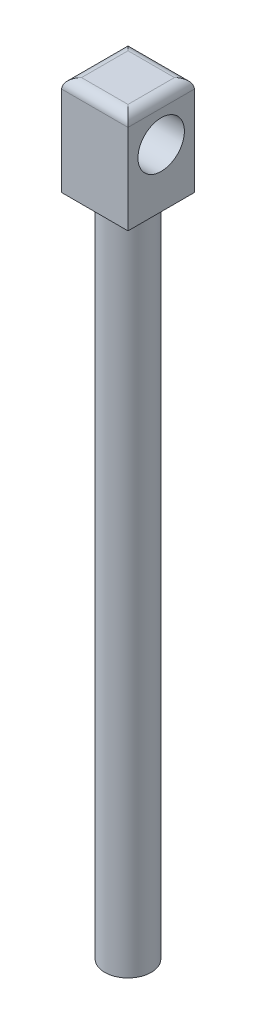
ISO-10303-21;
HEADER;
FILE_DESCRIPTION(('STEP AP214'),'2;1');
FILE_NAME('part.step','',(''),(''),'','','');
FILE_SCHEMA(('AUTOMOTIVE_DESIGN { 1 0 10303 214 1 1 1 1 }'));
ENDSEC;
DATA;
#1=APPLICATION_CONTEXT('core data for automotive mechanical design processes');
#2=APPLICATION_PROTOCOL_DEFINITION('international standard','automotive_design',2000,#1);
#3=PRODUCT_CONTEXT('',#1,'mechanical');
#4=PRODUCT('Part','Part','',(#3));
#5=PRODUCT_RELATED_PRODUCT_CATEGORY('part','',(#4));
#6=PRODUCT_DEFINITION_FORMATION('','',#4);
#7=PRODUCT_DEFINITION_CONTEXT('part definition',#1,'design');
#8=PRODUCT_DEFINITION('design','',#6,#7);
#9=PRODUCT_DEFINITION_SHAPE('','',#8);
#10=(LENGTH_UNIT() NAMED_UNIT(*) SI_UNIT(.MILLI.,.METRE.));
#11=(NAMED_UNIT(*) PLANE_ANGLE_UNIT() SI_UNIT($,.RADIAN.));
#12=(NAMED_UNIT(*) SI_UNIT($,.STERADIAN.) SOLID_ANGLE_UNIT());
#13=UNCERTAINTY_MEASURE_WITH_UNIT(LENGTH_MEASURE(1.E-05),#10,'distance_accuracy_value','');
#14=(GEOMETRIC_REPRESENTATION_CONTEXT(3) GLOBAL_UNCERTAINTY_ASSIGNED_CONTEXT((#13)) GLOBAL_UNIT_ASSIGNED_CONTEXT((#10,
#11,#12)) REPRESENTATION_CONTEXT('',''));
#15=CARTESIAN_POINT('',(0.,0.,0.));
#16=DIRECTION('',(0.,0.,1.));
#17=DIRECTION('',(1.,0.,0.));
#18=AXIS2_PLACEMENT_3D('',#15,#16,#17);
#19=CARTESIAN_POINT('',(0.,697.831291458778,0.));
#20=DIRECTION('',(0.,-1.,0.));
#21=DIRECTION('',(0.,0.,-1.));
#22=AXIS2_PLACEMENT_3D('',#19,#20,#21);
#23=CYLINDRICAL_SURFACE('',#22,35.56);
#24=CARTESIAN_POINT('',(0.,697.831291458778,0.));
#25=DIRECTION('',(0.,1.,0.));
#26=DIRECTION('',(0.,0.,1.));
#27=AXIS2_PLACEMENT_3D('',#24,#25,#26);
#28=CIRCLE('',#27,35.56);
#29=CARTESIAN_POINT('',(0.,697.831291458778,35.56));
#30=VERTEX_POINT('',#29);
#31=EDGE_CURVE('E127',#30,#30,#28,.T.);
#32=ORIENTED_EDGE('',*,*,#31,.F.);
#33=EDGE_LOOP('',(#32));
#34=FACE_BOUND('',#33,.T.);
#35=CARTESIAN_POINT('',(0.,-318.168708541222,0.));
#36=DIRECTION('',(0.,1.,0.));
#37=DIRECTION('',(0.,0.,1.));
#38=AXIS2_PLACEMENT_3D('',#35,#36,#37);
#39=CIRCLE('',#38,35.56);
#40=CARTESIAN_POINT('',(0.,-318.168708541222,35.56));
#41=VERTEX_POINT('',#40);
#42=EDGE_CURVE('E99',#41,#41,#39,.T.);
#43=ORIENTED_EDGE('',*,*,#42,.T.);
#44=EDGE_LOOP('',(#43));
#45=FACE_BOUND('',#44,.T.);
#46=ADVANCED_FACE('F35',(#34,#45),#23,.T.);
#47=CARTESIAN_POINT('',(0.,-318.168708541222,0.));
#48=DIRECTION('',(0.,1.,0.));
#49=DIRECTION('',(0.,0.,1.));
#50=AXIS2_PLACEMENT_3D('',#47,#48,#49);
#51=PLANE('',#50);
#52=ORIENTED_EDGE('',*,*,#42,.F.);
#53=EDGE_LOOP('',(#52));
#54=FACE_BOUND('',#53,.T.);
#55=ADVANCED_FACE('F184',(#54),#51,.F.);
#56=CARTESIAN_POINT('',(50.8,850.231291458778,50.8));
#57=DIRECTION('',(-1.,0.,0.));
#58=DIRECTION('',(0.,0.,1.));
#59=AXIS2_PLACEMENT_3D('',#56,#57,#58);
#60=PLANE('',#59);
#61=CARTESIAN_POINT('',(50.8,786.834028155751,0.));
#62=DIRECTION('',(-1.,0.,0.));
#63=DIRECTION('',(0.,0.,1.));
#64=AXIS2_PLACEMENT_3D('',#61,#62,#63);
#65=CIRCLE('',#64,35.56);
#66=CARTESIAN_POINT('',(50.8,786.834028155751,35.56));
#67=VERTEX_POINT('',#66);
#68=EDGE_CURVE('E113',#67,#67,#65,.T.);
#69=ORIENTED_EDGE('',*,*,#68,.T.);
#70=EDGE_LOOP('',(#69));
#71=FACE_BOUND('',#70,.T.);
#72=DIRECTION('',(0.,-1.,0.));
#73=VECTOR('',#72,1.);
#74=CARTESIAN_POINT('',(50.8,850.231291458778,-50.8));
#75=LINE('',#74,#73);
#76=CARTESIAN_POINT('',(50.8,834.991291458778,-50.8));
#77=VERTEX_POINT('',#76);
#78=CARTESIAN_POINT('',(50.8,697.831291458778,-50.8));
#79=VERTEX_POINT('',#78);
#80=EDGE_CURVE('E88',#77,#79,#75,.T.);
#81=ORIENTED_EDGE('',*,*,#80,.F.);
#82=DIRECTION('',(0.,0.,-1.));
#83=VECTOR('',#82,1.);
#84=CARTESIAN_POINT('',(50.8,834.991291458778,50.8));
#85=LINE('',#84,#83);
#86=CARTESIAN_POINT('',(50.8,834.991291458778,50.8));
#87=VERTEX_POINT('',#86);
#88=EDGE_CURVE('E141',#77,#87,#85,.F.);
#89=ORIENTED_EDGE('',*,*,#88,.T.);
#90=DIRECTION('',(0.,-1.,0.));
#91=VECTOR('',#90,1.);
#92=CARTESIAN_POINT('',(50.8,850.231291458778,50.8));
#93=LINE('',#92,#91);
#94=CARTESIAN_POINT('',(50.8,697.831291458778,50.8));
#95=VERTEX_POINT('',#94);
#96=EDGE_CURVE('E111',#87,#95,#93,.T.);
#97=ORIENTED_EDGE('',*,*,#96,.T.);
#98=DIRECTION('',(0.,0.,-1.));
#99=VECTOR('',#98,1.);
#100=CARTESIAN_POINT('',(50.8,697.831291458778,50.8));
#101=LINE('',#100,#99);
#102=EDGE_CURVE('E106',#95,#79,#101,.T.);
#103=ORIENTED_EDGE('',*,*,#102,.T.);
#104=EDGE_LOOP('',(#81,#89,#97,#103));
#105=FACE_BOUND('',#104,.T.);
#106=ADVANCED_FACE('F110',(#71,#105),#60,.F.);
#107=CARTESIAN_POINT('',(-50.8,850.231291458778,-50.8));
#108=DIRECTION('',(0.,0.,1.));
#109=DIRECTION('',(1.,0.,0.));
#110=AXIS2_PLACEMENT_3D('',#107,#108,#109);
#111=PLANE('',#110);
#112=DIRECTION('',(0.,-1.,0.));
#113=VECTOR('',#112,1.);
#114=CARTESIAN_POINT('',(-50.8,850.231291458778,-50.8));
#115=LINE('',#114,#113);
#116=CARTESIAN_POINT('',(-50.8,834.991291458778,-50.8));
#117=VERTEX_POINT('',#116);
#118=CARTESIAN_POINT('',(-50.8,697.831291458778,-50.8));
#119=VERTEX_POINT('',#118);
#120=EDGE_CURVE('E100',#117,#119,#115,.T.);
#121=ORIENTED_EDGE('',*,*,#120,.F.);
#122=DIRECTION('',(-1.,0.,0.));
#123=VECTOR('',#122,1.);
#124=CARTESIAN_POINT('',(-50.8,834.991291458778,-50.8));
#125=LINE('',#124,#123);
#126=EDGE_CURVE('E94',#117,#77,#125,.F.);
#127=ORIENTED_EDGE('',*,*,#126,.T.);
#128=ORIENTED_EDGE('',*,*,#80,.T.);
#129=DIRECTION('',(-1.,0.,0.));
#130=VECTOR('',#129,1.);
#131=CARTESIAN_POINT('',(-50.8,697.831291458778,-50.8));
#132=LINE('',#131,#130);
#133=EDGE_CURVE('E91',#79,#119,#132,.T.);
#134=ORIENTED_EDGE('',*,*,#133,.T.);
#135=EDGE_LOOP('',(#121,#127,#128,#134));
#136=FACE_BOUND('',#135,.T.);
#137=ADVANCED_FACE('F90',(#136),#111,.F.);
#138=CARTESIAN_POINT('',(-50.8,850.231291458778,50.8));
#139=DIRECTION('',(1.,0.,0.));
#140=DIRECTION('',(0.,0.,-1.));
#141=AXIS2_PLACEMENT_3D('',#138,#139,#140);
#142=PLANE('',#141);
#143=CARTESIAN_POINT('',(-50.8,786.834028155751,0.));
#144=DIRECTION('',(-1.,0.,0.));
#145=DIRECTION('',(0.,0.,1.));
#146=AXIS2_PLACEMENT_3D('',#143,#144,#145);
#147=CIRCLE('',#146,35.56);
#148=CARTESIAN_POINT('',(-50.8,786.834028155751,35.56));
#149=VERTEX_POINT('',#148);
#150=EDGE_CURVE('E116',#149,#149,#147,.T.);
#151=ORIENTED_EDGE('',*,*,#150,.F.);
#152=EDGE_LOOP('',(#151));
#153=FACE_BOUND('',#152,.T.);
#154=DIRECTION('',(0.,-1.,0.));
#155=VECTOR('',#154,1.);
#156=CARTESIAN_POINT('',(-50.8,850.231291458778,50.8));
#157=LINE('',#156,#155);
#158=CARTESIAN_POINT('',(-50.8,834.991291458778,50.8));
#159=VERTEX_POINT('',#158);
#160=CARTESIAN_POINT('',(-50.8,697.831291458778,50.8));
#161=VERTEX_POINT('',#160);
#162=EDGE_CURVE('E124',#159,#161,#157,.T.);
#163=ORIENTED_EDGE('',*,*,#162,.F.);
#164=DIRECTION('',(0.,0.,1.));
#165=VECTOR('',#164,1.);
#166=CARTESIAN_POINT('',(-50.8,834.991291458778,50.8));
#167=LINE('',#166,#165);
#168=EDGE_CURVE('E44',#159,#117,#167,.F.);
#169=ORIENTED_EDGE('',*,*,#168,.T.);
#170=ORIENTED_EDGE('',*,*,#120,.T.);
#171=DIRECTION('',(0.,0.,1.));
#172=VECTOR('',#171,1.);
#173=CARTESIAN_POINT('',(-50.8,697.831291458778,50.8));
#174=LINE('',#173,#172);
#175=EDGE_CURVE('E108',#119,#161,#174,.T.);
#176=ORIENTED_EDGE('',*,*,#175,.T.);
#177=EDGE_LOOP('',(#163,#169,#170,#176));
#178=FACE_BOUND('',#177,.T.);
#179=ADVANCED_FACE('F162',(#153,#178),#142,.F.);
#180=CARTESIAN_POINT('',(-50.8,850.231291458778,50.8));
#181=DIRECTION('',(0.,0.,-1.));
#182=DIRECTION('',(-1.,0.,0.));
#183=AXIS2_PLACEMENT_3D('',#180,#181,#182);
#184=PLANE('',#183);
#185=ORIENTED_EDGE('',*,*,#96,.F.);
#186=DIRECTION('',(1.,0.,0.));
#187=VECTOR('',#186,1.);
#188=CARTESIAN_POINT('',(-50.8,834.991291458778,50.8));
#189=LINE('',#188,#187);
#190=EDGE_CURVE('E11',#87,#159,#189,.F.);
#191=ORIENTED_EDGE('',*,*,#190,.T.);
#192=ORIENTED_EDGE('',*,*,#162,.T.);
#193=DIRECTION('',(1.,0.,0.));
#194=VECTOR('',#193,1.);
#195=CARTESIAN_POINT('',(-50.8,697.831291458778,50.8));
#196=LINE('',#195,#194);
#197=EDGE_CURVE('E121',#161,#95,#196,.T.);
#198=ORIENTED_EDGE('',*,*,#197,.T.);
#199=EDGE_LOOP('',(#185,#191,#192,#198));
#200=FACE_BOUND('',#199,.T.);
#201=ADVANCED_FACE('F164',(#200),#184,.F.);
#202=CARTESIAN_POINT('',(0.,850.231291458778,0.));
#203=DIRECTION('',(0.,-1.,0.));
#204=DIRECTION('',(0.,0.,-1.));
#205=AXIS2_PLACEMENT_3D('',#202,#203,#204);
#206=PLANE('',#205);
#207=DIRECTION('',(1.,0.,0.));
#208=VECTOR('',#207,1.);
#209=CARTESIAN_POINT('',(0.,850.231291458778,35.56));
#210=LINE('',#209,#208);
#211=CARTESIAN_POINT('',(-35.56,850.231291458778,35.56));
#212=VERTEX_POINT('',#211);
#213=CARTESIAN_POINT('',(35.56,850.231291458778,35.56));
#214=VERTEX_POINT('',#213);
#215=EDGE_CURVE('E130',#212,#214,#210,.T.);
#216=ORIENTED_EDGE('',*,*,#215,.T.);
#217=DIRECTION('',(0.,0.,-1.));
#218=VECTOR('',#217,1.);
#219=CARTESIAN_POINT('',(35.56,850.231291458778,0.));
#220=LINE('',#219,#218);
#221=CARTESIAN_POINT('',(35.56,850.231291458778,-35.56));
#222=VERTEX_POINT('',#221);
#223=EDGE_CURVE('E138',#214,#222,#220,.T.);
#224=ORIENTED_EDGE('',*,*,#223,.T.);
#225=DIRECTION('',(-1.,0.,0.));
#226=VECTOR('',#225,1.);
#227=CARTESIAN_POINT('',(0.,850.231291458778,-35.56));
#228=LINE('',#227,#226);
#229=CARTESIAN_POINT('',(-35.56,850.231291458778,-35.56));
#230=VERTEX_POINT('',#229);
#231=EDGE_CURVE('E136',#222,#230,#228,.T.);
#232=ORIENTED_EDGE('',*,*,#231,.T.);
#233=DIRECTION('',(0.,0.,1.));
#234=VECTOR('',#233,1.);
#235=CARTESIAN_POINT('',(-35.56,850.231291458778,0.));
#236=LINE('',#235,#234);
#237=EDGE_CURVE('E134',#230,#212,#236,.T.);
#238=ORIENTED_EDGE('',*,*,#237,.T.);
#239=EDGE_LOOP('',(#216,#224,#232,#238));
#240=FACE_BOUND('',#239,.T.);
#241=ADVANCED_FACE('F175',(#240),#206,.F.);
#242=CARTESIAN_POINT('',(0.,697.831291458778,0.));
#243=DIRECTION('',(0.,-1.,0.));
#244=DIRECTION('',(0.,0.,-1.));
#245=AXIS2_PLACEMENT_3D('',#242,#243,#244);
#246=PLANE('',#245);
#247=ORIENTED_EDGE('',*,*,#31,.T.);
#248=EDGE_LOOP('',(#247));
#249=FACE_BOUND('',#248,.T.);
#250=ORIENTED_EDGE('',*,*,#102,.F.);
#251=ORIENTED_EDGE('',*,*,#197,.F.);
#252=ORIENTED_EDGE('',*,*,#175,.F.);
#253=ORIENTED_EDGE('',*,*,#133,.F.);
#254=EDGE_LOOP('',(#250,#251,#252,#253));
#255=FACE_BOUND('',#254,.T.);
#256=ADVANCED_FACE('F104',(#249,#255),#246,.T.);
#257=CARTESIAN_POINT('',(50.8,786.834028155751,0.));
#258=DIRECTION('',(-1.,0.,0.));
#259=DIRECTION('',(0.,0.,1.));
#260=AXIS2_PLACEMENT_3D('',#257,#258,#259);
#261=CYLINDRICAL_SURFACE('',#260,35.56);
#262=ORIENTED_EDGE('',*,*,#68,.F.);
#263=EDGE_LOOP('',(#262));
#264=FACE_BOUND('',#263,.T.);
#265=ORIENTED_EDGE('',*,*,#150,.T.);
#266=EDGE_LOOP('',(#265));
#267=FACE_BOUND('',#266,.T.);
#268=ADVANCED_FACE('F160',(#264,#267),#261,.F.);
#269=CARTESIAN_POINT('',(-35.56,834.991291458778,0.));
#270=DIRECTION('',(0.,0.,1.));
#271=DIRECTION('',(1.,0.,0.));
#272=AXIS2_PLACEMENT_3D('',#269,#270,#271);
#273=CYLINDRICAL_SURFACE('',#272,15.24);
#274=CARTESIAN_POINT('',(-35.56,834.991291458778,-35.56));
#275=DIRECTION('',(-0.707106781186547,0.,0.707106781186547));
#276=DIRECTION('',(0.707106781186547,0.,0.707106781186547));
#277=AXIS2_PLACEMENT_3D('',#274,#275,#276);
#278=ELLIPSE('',#277,21.552614690566,15.24);
#279=EDGE_CURVE('E148',#117,#230,#278,.F.);
#280=ORIENTED_EDGE('',*,*,#279,.F.);
#281=ORIENTED_EDGE('',*,*,#168,.F.);
#282=CARTESIAN_POINT('',(-35.56,834.991291458778,35.56));
#283=DIRECTION('',(0.707106781186547,0.,0.707106781186547));
#284=DIRECTION('',(0.707106781186547,0.,-0.707106781186547));
#285=AXIS2_PLACEMENT_3D('',#282,#283,#284);
#286=ELLIPSE('',#285,21.552614690566,15.24);
#287=EDGE_CURVE('E39',#212,#159,#286,.T.);
#288=ORIENTED_EDGE('',*,*,#287,.F.);
#289=ORIENTED_EDGE('',*,*,#237,.F.);
#290=EDGE_LOOP('',(#280,#281,#288,#289));
#291=FACE_BOUND('',#290,.T.);
#292=ADVANCED_FACE('F37',(#291),#273,.T.);
#293=CARTESIAN_POINT('',(0.,834.991291458778,35.56));
#294=DIRECTION('',(1.,0.,0.));
#295=DIRECTION('',(0.,0.,-1.));
#296=AXIS2_PLACEMENT_3D('',#293,#294,#295);
#297=CYLINDRICAL_SURFACE('',#296,15.24);
#298=ORIENTED_EDGE('',*,*,#287,.T.);
#299=ORIENTED_EDGE('',*,*,#190,.F.);
#300=CARTESIAN_POINT('',(35.56,834.991291458778,35.56));
#301=DIRECTION('',(0.707106781186547,0.,-0.707106781186547));
#302=DIRECTION('',(0.707106781186547,0.,0.707106781186547));
#303=AXIS2_PLACEMENT_3D('',#300,#301,#302);
#304=ELLIPSE('',#303,21.552614690566,15.24);
#305=EDGE_CURVE('E147',#214,#87,#304,.T.);
#306=ORIENTED_EDGE('',*,*,#305,.F.);
#307=ORIENTED_EDGE('',*,*,#215,.F.);
#308=EDGE_LOOP('',(#298,#299,#306,#307));
#309=FACE_BOUND('',#308,.T.);
#310=ADVANCED_FACE('F199',(#309),#297,.T.);
#311=CARTESIAN_POINT('',(0.,834.991291458778,-35.56));
#312=DIRECTION('',(-1.,0.,0.));
#313=DIRECTION('',(0.,0.,1.));
#314=AXIS2_PLACEMENT_3D('',#311,#312,#313);
#315=CYLINDRICAL_SURFACE('',#314,15.24);
#316=ORIENTED_EDGE('',*,*,#279,.T.);
#317=ORIENTED_EDGE('',*,*,#231,.F.);
#318=CARTESIAN_POINT('',(35.56,834.991291458778,-35.56));
#319=DIRECTION('',(-0.707106781186547,0.,-0.707106781186547));
#320=DIRECTION('',(-0.707106781186547,0.,0.707106781186547));
#321=AXIS2_PLACEMENT_3D('',#318,#319,#320);
#322=ELLIPSE('',#321,21.552614690566,15.24);
#323=EDGE_CURVE('E145',#77,#222,#322,.F.);
#324=ORIENTED_EDGE('',*,*,#323,.F.);
#325=ORIENTED_EDGE('',*,*,#126,.F.);
#326=EDGE_LOOP('',(#316,#317,#324,#325));
#327=FACE_BOUND('',#326,.T.);
#328=ADVANCED_FACE('F169',(#327),#315,.T.);
#329=CARTESIAN_POINT('',(35.56,834.991291458778,0.));
#330=DIRECTION('',(0.,0.,-1.));
#331=DIRECTION('',(-1.,0.,0.));
#332=AXIS2_PLACEMENT_3D('',#329,#330,#331);
#333=CYLINDRICAL_SURFACE('',#332,15.24);
#334=ORIENTED_EDGE('',*,*,#305,.T.);
#335=ORIENTED_EDGE('',*,*,#88,.F.);
#336=ORIENTED_EDGE('',*,*,#323,.T.);
#337=ORIENTED_EDGE('',*,*,#223,.F.);
#338=EDGE_LOOP('',(#334,#335,#336,#337));
#339=FACE_BOUND('',#338,.T.);
#340=ADVANCED_FACE('F172',(#339),#333,.T.);
#341=CLOSED_SHELL('',(#46,#55,#106,#137,#179,#201,#241,#256,#268,#292,#310,#328,#340));
#342=MANIFOLD_SOLID_BREP('B2',#341);
#343=ADVANCED_BREP_SHAPE_REPRESENTATION('',(#18,#342),#14);
#344=SHAPE_DEFINITION_REPRESENTATION(#9,#343);
ENDSEC;
END-ISO-10303-21;
